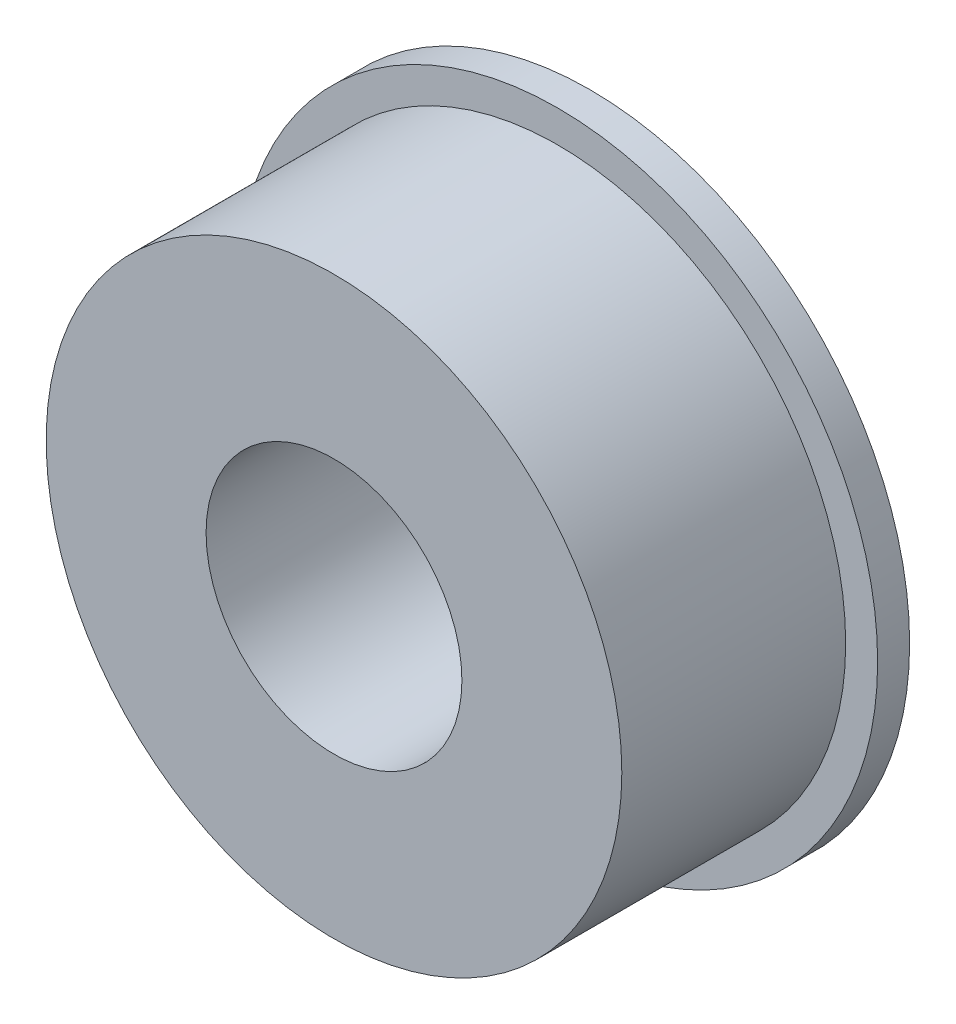
ISO-10303-21;
HEADER;
FILE_DESCRIPTION(('STEP AP214'),'2;1');
FILE_NAME('part.step','',(''),(''),'','','');
FILE_SCHEMA(('AUTOMOTIVE_DESIGN { 1 0 10303 214 1 1 1 1 }'));
ENDSEC;
DATA;
#1=APPLICATION_CONTEXT('core data for automotive mechanical design processes');
#2=APPLICATION_PROTOCOL_DEFINITION('international standard','automotive_design',2000,#1);
#3=PRODUCT_CONTEXT('',#1,'mechanical');
#4=PRODUCT('Part','Part','',(#3));
#5=PRODUCT_RELATED_PRODUCT_CATEGORY('part','',(#4));
#6=PRODUCT_DEFINITION_FORMATION('','',#4);
#7=PRODUCT_DEFINITION_CONTEXT('part definition',#1,'design');
#8=PRODUCT_DEFINITION('design','',#6,#7);
#9=PRODUCT_DEFINITION_SHAPE('','',#8);
#10=(LENGTH_UNIT() NAMED_UNIT(*) SI_UNIT(.MILLI.,.METRE.));
#11=(NAMED_UNIT(*) PLANE_ANGLE_UNIT() SI_UNIT($,.RADIAN.));
#12=(NAMED_UNIT(*) SI_UNIT($,.STERADIAN.) SOLID_ANGLE_UNIT());
#13=UNCERTAINTY_MEASURE_WITH_UNIT(LENGTH_MEASURE(1.E-05),#10,'distance_accuracy_value','');
#14=(GEOMETRIC_REPRESENTATION_CONTEXT(3) GLOBAL_UNCERTAINTY_ASSIGNED_CONTEXT((#13)) GLOBAL_UNIT_ASSIGNED_CONTEXT((#10,
#11,#12)) REPRESENTATION_CONTEXT('',''));
#15=CARTESIAN_POINT('',(0.,0.,0.));
#16=DIRECTION('',(0.,0.,1.));
#17=DIRECTION('',(1.,0.,0.));
#18=AXIS2_PLACEMENT_3D('',#15,#16,#17);
#19=CARTESIAN_POINT('',(0.,0.,1.5875));
#20=DIRECTION('',(0.,0.,1.));
#21=DIRECTION('',(1.,0.,0.));
#22=AXIS2_PLACEMENT_3D('',#19,#20,#21);
#23=PLANE('',#22);
#24=CARTESIAN_POINT('',(0.,0.,1.5875));
#25=DIRECTION('',(0.,0.,1.));
#26=DIRECTION('',(1.,0.,0.));
#27=AXIS2_PLACEMENT_3D('',#24,#25,#26);
#28=CIRCLE('',#27,15.875);
#29=CARTESIAN_POINT('',(15.875,0.,1.5875));
#30=VERTEX_POINT('',#29);
#31=EDGE_CURVE('E10',#30,#30,#28,.T.);
#32=ORIENTED_EDGE('',*,*,#31,.T.);
#33=EDGE_LOOP('',(#32));
#34=FACE_BOUND('',#33,.T.);
#35=CARTESIAN_POINT('',(0.,0.,1.5875));
#36=DIRECTION('',(0.,0.,1.));
#37=DIRECTION('',(1.,0.,0.));
#38=AXIS2_PLACEMENT_3D('',#35,#36,#37);
#39=CIRCLE('',#38,14.2875);
#40=CARTESIAN_POINT('',(14.2875,0.,1.5875));
#41=VERTEX_POINT('',#40);
#42=EDGE_CURVE('E46',#41,#41,#39,.T.);
#43=ORIENTED_EDGE('',*,*,#42,.F.);
#44=EDGE_LOOP('',(#43));
#45=FACE_BOUND('',#44,.T.);
#46=ADVANCED_FACE('F33',(#34,#45),#23,.T.);
#47=CARTESIAN_POINT('',(0.,0.,1.5875));
#48=DIRECTION('',(0.,0.,-1.));
#49=DIRECTION('',(-1.,0.,0.));
#50=AXIS2_PLACEMENT_3D('',#47,#48,#49);
#51=CYLINDRICAL_SURFACE('',#50,15.875);
#52=ORIENTED_EDGE('',*,*,#31,.F.);
#53=EDGE_LOOP('',(#52));
#54=FACE_BOUND('',#53,.T.);
#55=CARTESIAN_POINT('',(0.,0.,0.));
#56=DIRECTION('',(0.,0.,1.));
#57=DIRECTION('',(1.,0.,0.));
#58=AXIS2_PLACEMENT_3D('',#55,#56,#57);
#59=CIRCLE('',#58,15.875);
#60=CARTESIAN_POINT('',(15.875,0.,0.));
#61=VERTEX_POINT('',#60);
#62=EDGE_CURVE('E37',#61,#61,#59,.T.);
#63=ORIENTED_EDGE('',*,*,#62,.T.);
#64=EDGE_LOOP('',(#63));
#65=FACE_BOUND('',#64,.T.);
#66=ADVANCED_FACE('F35',(#54,#65),#51,.T.);
#67=CARTESIAN_POINT('',(0.,0.,0.));
#68=DIRECTION('',(0.,0.,1.));
#69=DIRECTION('',(1.,0.,0.));
#70=AXIS2_PLACEMENT_3D('',#67,#68,#69);
#71=PLANE('',#70);
#72=CARTESIAN_POINT('',(0.,0.,0.));
#73=DIRECTION('',(0.,0.,1.));
#74=DIRECTION('',(1.,0.,0.));
#75=AXIS2_PLACEMENT_3D('',#72,#73,#74);
#76=CIRCLE('',#75,6.35);
#77=CARTESIAN_POINT('',(6.35,0.,0.));
#78=VERTEX_POINT('',#77);
#79=EDGE_CURVE('E49',#78,#78,#76,.T.);
#80=ORIENTED_EDGE('',*,*,#79,.T.);
#81=EDGE_LOOP('',(#80));
#82=FACE_BOUND('',#81,.T.);
#83=ORIENTED_EDGE('',*,*,#62,.F.);
#84=EDGE_LOOP('',(#83));
#85=FACE_BOUND('',#84,.T.);
#86=ADVANCED_FACE('F58',(#82,#85),#71,.F.);
#87=CARTESIAN_POINT('',(0.,0.,12.7));
#88=DIRECTION('',(0.,0.,-1.));
#89=DIRECTION('',(-1.,0.,0.));
#90=AXIS2_PLACEMENT_3D('',#87,#88,#89);
#91=CYLINDRICAL_SURFACE('',#90,14.2875);
#92=CARTESIAN_POINT('',(0.,0.,12.7));
#93=DIRECTION('',(0.,0.,1.));
#94=DIRECTION('',(1.,0.,0.));
#95=AXIS2_PLACEMENT_3D('',#92,#93,#94);
#96=CIRCLE('',#95,14.2875);
#97=CARTESIAN_POINT('',(14.2875,0.,12.7));
#98=VERTEX_POINT('',#97);
#99=EDGE_CURVE('E44',#98,#98,#96,.T.);
#100=ORIENTED_EDGE('',*,*,#99,.F.);
#101=EDGE_LOOP('',(#100));
#102=FACE_BOUND('',#101,.T.);
#103=ORIENTED_EDGE('',*,*,#42,.T.);
#104=EDGE_LOOP('',(#103));
#105=FACE_BOUND('',#104,.T.);
#106=ADVANCED_FACE('F70',(#102,#105),#91,.T.);
#107=CARTESIAN_POINT('',(0.,0.,12.7));
#108=DIRECTION('',(0.,0.,1.));
#109=DIRECTION('',(1.,0.,0.));
#110=AXIS2_PLACEMENT_3D('',#107,#108,#109);
#111=PLANE('',#110);
#112=CARTESIAN_POINT('',(0.,0.,12.7));
#113=DIRECTION('',(0.,0.,1.));
#114=DIRECTION('',(1.,0.,0.));
#115=AXIS2_PLACEMENT_3D('',#112,#113,#114);
#116=CIRCLE('',#115,6.35);
#117=CARTESIAN_POINT('',(6.35,0.,12.7));
#118=VERTEX_POINT('',#117);
#119=EDGE_CURVE('E52',#118,#118,#116,.T.);
#120=ORIENTED_EDGE('',*,*,#119,.F.);
#121=EDGE_LOOP('',(#120));
#122=FACE_BOUND('',#121,.T.);
#123=ORIENTED_EDGE('',*,*,#99,.T.);
#124=EDGE_LOOP('',(#123));
#125=FACE_BOUND('',#124,.T.);
#126=ADVANCED_FACE('F64',(#122,#125),#111,.T.);
#127=CARTESIAN_POINT('',(0.,0.,0.));
#128=DIRECTION('',(0.,0.,1.));
#129=DIRECTION('',(1.,0.,0.));
#130=AXIS2_PLACEMENT_3D('',#127,#128,#129);
#131=CYLINDRICAL_SURFACE('',#130,6.35);
#132=ORIENTED_EDGE('',*,*,#79,.F.);
#133=EDGE_LOOP('',(#132));
#134=FACE_BOUND('',#133,.T.);
#135=ORIENTED_EDGE('',*,*,#119,.T.);
#136=EDGE_LOOP('',(#135));
#137=FACE_BOUND('',#136,.T.);
#138=ADVANCED_FACE('F61',(#134,#137),#131,.F.);
#139=CLOSED_SHELL('',(#46,#66,#86,#106,#126,#138));
#140=MANIFOLD_SOLID_BREP('B2',#139);
#141=ADVANCED_BREP_SHAPE_REPRESENTATION('',(#18,#140),#14);
#142=SHAPE_DEFINITION_REPRESENTATION(#9,#141);
ENDSEC;
END-ISO-10303-21;
